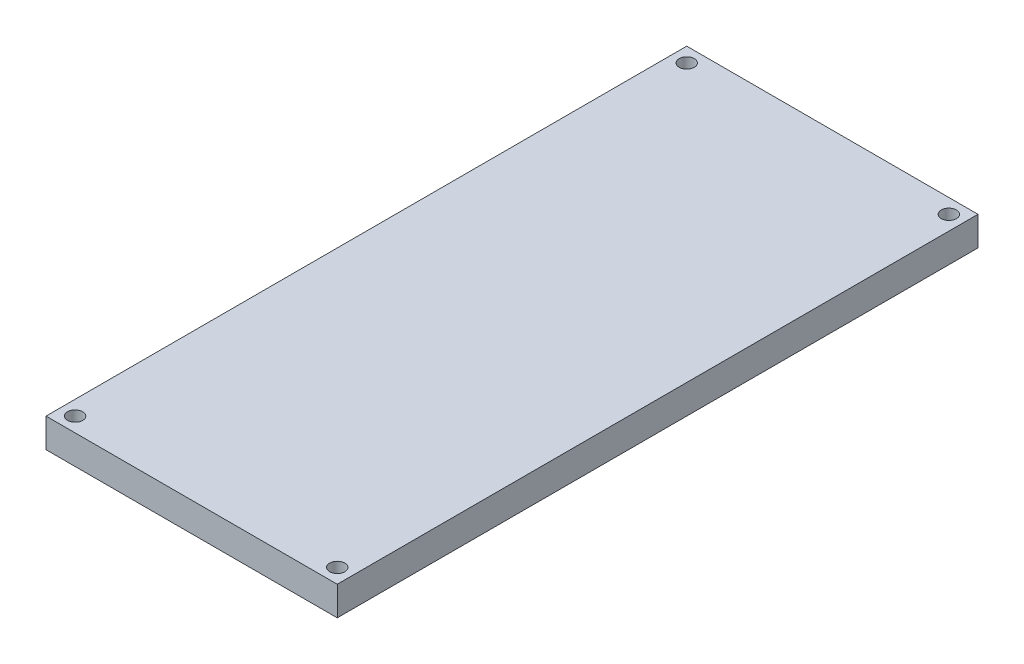
ISO-10303-21;
HEADER;
FILE_DESCRIPTION(('STEP AP214'),'2;1');
FILE_NAME('part.step','',(''),(''),'','','');
FILE_SCHEMA(('AUTOMOTIVE_DESIGN { 1 0 10303 214 1 1 1 1 }'));
ENDSEC;
DATA;
#1=APPLICATION_CONTEXT('core data for automotive mechanical design processes');
#2=APPLICATION_PROTOCOL_DEFINITION('international standard','automotive_design',2000,#1);
#3=PRODUCT_CONTEXT('',#1,'mechanical');
#4=PRODUCT('Part','Part','',(#3));
#5=PRODUCT_RELATED_PRODUCT_CATEGORY('part','',(#4));
#6=PRODUCT_DEFINITION_FORMATION('','',#4);
#7=PRODUCT_DEFINITION_CONTEXT('part definition',#1,'design');
#8=PRODUCT_DEFINITION('design','',#6,#7);
#9=PRODUCT_DEFINITION_SHAPE('','',#8);
#10=(LENGTH_UNIT() NAMED_UNIT(*) SI_UNIT(.MILLI.,.METRE.));
#11=(NAMED_UNIT(*) PLANE_ANGLE_UNIT() SI_UNIT($,.RADIAN.));
#12=(NAMED_UNIT(*) SI_UNIT($,.STERADIAN.) SOLID_ANGLE_UNIT());
#13=UNCERTAINTY_MEASURE_WITH_UNIT(LENGTH_MEASURE(1.E-05),#10,'distance_accuracy_value','');
#14=(GEOMETRIC_REPRESENTATION_CONTEXT(3) GLOBAL_UNCERTAINTY_ASSIGNED_CONTEXT((#13)) GLOBAL_UNIT_ASSIGNED_CONTEXT((#10,
#11,#12)) REPRESENTATION_CONTEXT('',''));
#15=CARTESIAN_POINT('',(0.,0.,0.));
#16=DIRECTION('',(0.,0.,1.));
#17=DIRECTION('',(1.,0.,0.));
#18=AXIS2_PLACEMENT_3D('',#15,#16,#17);
#19=CARTESIAN_POINT('',(31.75,6.35,69.85));
#20=DIRECTION('',(-1.,0.,0.));
#21=DIRECTION('',(0.,0.,1.));
#22=AXIS2_PLACEMENT_3D('',#19,#20,#21);
#23=PLANE('',#22);
#24=DIRECTION('',(0.,0.,-1.));
#25=VECTOR('',#24,1.);
#26=CARTESIAN_POINT('',(31.75,0.,69.85));
#27=LINE('',#26,#25);
#28=CARTESIAN_POINT('',(31.75,0.,69.85));
#29=VERTEX_POINT('',#28);
#30=CARTESIAN_POINT('',(31.75,0.,-69.85));
#31=VERTEX_POINT('',#30);
#32=EDGE_CURVE('E113',#29,#31,#27,.T.);
#33=ORIENTED_EDGE('',*,*,#32,.T.);
#34=DIRECTION('',(0.,-1.,0.));
#35=VECTOR('',#34,1.);
#36=CARTESIAN_POINT('',(31.75,6.35,-69.85));
#37=LINE('',#36,#35);
#38=CARTESIAN_POINT('',(31.75,6.35,-69.85));
#39=VERTEX_POINT('',#38);
#40=EDGE_CURVE('E11',#39,#31,#37,.T.);
#41=ORIENTED_EDGE('',*,*,#40,.F.);
#42=DIRECTION('',(0.,0.,-1.));
#43=VECTOR('',#42,1.);
#44=CARTESIAN_POINT('',(31.75,6.35,69.85));
#45=LINE('',#44,#43);
#46=CARTESIAN_POINT('',(31.75,6.35,69.85));
#47=VERTEX_POINT('',#46);
#48=EDGE_CURVE('E97',#47,#39,#45,.T.);
#49=ORIENTED_EDGE('',*,*,#48,.F.);
#50=DIRECTION('',(0.,-1.,0.));
#51=VECTOR('',#50,1.);
#52=CARTESIAN_POINT('',(31.75,6.35,69.85));
#53=LINE('',#52,#51);
#54=EDGE_CURVE('E109',#47,#29,#53,.T.);
#55=ORIENTED_EDGE('',*,*,#54,.T.);
#56=EDGE_LOOP('',(#33,#41,#49,#55));
#57=FACE_BOUND('',#56,.T.);
#58=ADVANCED_FACE('F45',(#57),#23,.F.);
#59=CARTESIAN_POINT('',(-31.75,6.35,-69.85));
#60=DIRECTION('',(0.,0.,1.));
#61=DIRECTION('',(1.,0.,0.));
#62=AXIS2_PLACEMENT_3D('',#59,#60,#61);
#63=PLANE('',#62);
#64=DIRECTION('',(-1.,0.,0.));
#65=VECTOR('',#64,1.);
#66=CARTESIAN_POINT('',(-31.75,0.,-69.85));
#67=LINE('',#66,#65);
#68=CARTESIAN_POINT('',(-31.75,0.,-69.85));
#69=VERTEX_POINT('',#68);
#70=EDGE_CURVE('E102',#31,#69,#67,.T.);
#71=ORIENTED_EDGE('',*,*,#70,.T.);
#72=DIRECTION('',(0.,-1.,0.));
#73=VECTOR('',#72,1.);
#74=CARTESIAN_POINT('',(-31.75,6.35,-69.85));
#75=LINE('',#74,#73);
#76=CARTESIAN_POINT('',(-31.75,6.35,-69.85));
#77=VERTEX_POINT('',#76);
#78=EDGE_CURVE('E54',#77,#69,#75,.T.);
#79=ORIENTED_EDGE('',*,*,#78,.F.);
#80=DIRECTION('',(-1.,0.,0.));
#81=VECTOR('',#80,1.);
#82=CARTESIAN_POINT('',(-31.75,6.35,-69.85));
#83=LINE('',#82,#81);
#84=EDGE_CURVE('E92',#39,#77,#83,.T.);
#85=ORIENTED_EDGE('',*,*,#84,.F.);
#86=ORIENTED_EDGE('',*,*,#40,.T.);
#87=EDGE_LOOP('',(#71,#79,#85,#86));
#88=FACE_BOUND('',#87,.T.);
#89=ADVANCED_FACE('F101',(#88),#63,.F.);
#90=CARTESIAN_POINT('',(-31.75,6.35,69.85));
#91=DIRECTION('',(1.,0.,0.));
#92=DIRECTION('',(0.,0.,-1.));
#93=AXIS2_PLACEMENT_3D('',#90,#91,#92);
#94=PLANE('',#93);
#95=DIRECTION('',(0.,0.,1.));
#96=VECTOR('',#95,1.);
#97=CARTESIAN_POINT('',(-31.75,0.,69.85));
#98=LINE('',#97,#96);
#99=CARTESIAN_POINT('',(-31.75,0.,69.85));
#100=VERTEX_POINT('',#99);
#101=EDGE_CURVE('E79',#69,#100,#98,.T.);
#102=ORIENTED_EDGE('',*,*,#101,.T.);
#103=DIRECTION('',(0.,-1.,0.));
#104=VECTOR('',#103,1.);
#105=CARTESIAN_POINT('',(-31.75,6.35,69.85));
#106=LINE('',#105,#104);
#107=CARTESIAN_POINT('',(-31.75,6.35,69.85));
#108=VERTEX_POINT('',#107);
#109=EDGE_CURVE('E104',#108,#100,#106,.T.);
#110=ORIENTED_EDGE('',*,*,#109,.F.);
#111=DIRECTION('',(0.,0.,1.));
#112=VECTOR('',#111,1.);
#113=CARTESIAN_POINT('',(-31.75,6.35,69.85));
#114=LINE('',#113,#112);
#115=EDGE_CURVE('E95',#77,#108,#114,.T.);
#116=ORIENTED_EDGE('',*,*,#115,.F.);
#117=ORIENTED_EDGE('',*,*,#78,.T.);
#118=EDGE_LOOP('',(#102,#110,#116,#117));
#119=FACE_BOUND('',#118,.T.);
#120=ADVANCED_FACE('F105',(#119),#94,.F.);
#121=CARTESIAN_POINT('',(-31.75,6.35,69.85));
#122=DIRECTION('',(0.,0.,-1.));
#123=DIRECTION('',(-1.,0.,0.));
#124=AXIS2_PLACEMENT_3D('',#121,#122,#123);
#125=PLANE('',#124);
#126=DIRECTION('',(1.,0.,0.));
#127=VECTOR('',#126,1.);
#128=CARTESIAN_POINT('',(-31.75,0.,69.85));
#129=LINE('',#128,#127);
#130=EDGE_CURVE('E85',#100,#29,#129,.T.);
#131=ORIENTED_EDGE('',*,*,#130,.T.);
#132=ORIENTED_EDGE('',*,*,#54,.F.);
#133=DIRECTION('',(1.,0.,0.));
#134=VECTOR('',#133,1.);
#135=CARTESIAN_POINT('',(-31.75,6.35,69.85));
#136=LINE('',#135,#134);
#137=EDGE_CURVE('E62',#108,#47,#136,.T.);
#138=ORIENTED_EDGE('',*,*,#137,.F.);
#139=ORIENTED_EDGE('',*,*,#109,.T.);
#140=EDGE_LOOP('',(#131,#132,#138,#139));
#141=FACE_BOUND('',#140,.T.);
#142=ADVANCED_FACE('F127',(#141),#125,.F.);
#143=CARTESIAN_POINT('',(0.,6.35,0.));
#144=DIRECTION('',(0.,-1.,0.));
#145=DIRECTION('',(0.,0.,-1.));
#146=AXIS2_PLACEMENT_3D('',#143,#144,#145);
#147=PLANE('',#146);
#148=CARTESIAN_POINT('',(-28.575,6.35,-66.675));
#149=DIRECTION('',(0.,1.,0.));
#150=DIRECTION('',(0.,0.,1.));
#151=AXIS2_PLACEMENT_3D('',#148,#149,#150);
#152=CIRCLE('',#151,1.65);
#153=CARTESIAN_POINT('',(-28.575,6.35,-65.025));
#154=VERTEX_POINT('',#153);
#155=EDGE_CURVE('E146',#154,#154,#152,.T.);
#156=ORIENTED_EDGE('',*,*,#155,.F.);
#157=EDGE_LOOP('',(#156));
#158=FACE_BOUND('',#157,.T.);
#159=CARTESIAN_POINT('',(-28.575,6.35,66.675));
#160=DIRECTION('',(0.,1.,0.));
#161=DIRECTION('',(0.,0.,1.));
#162=AXIS2_PLACEMENT_3D('',#159,#160,#161);
#163=CIRCLE('',#162,1.65);
#164=CARTESIAN_POINT('',(-28.575,6.35,68.325));
#165=VERTEX_POINT('',#164);
#166=EDGE_CURVE('E154',#165,#165,#163,.T.);
#167=ORIENTED_EDGE('',*,*,#166,.F.);
#168=EDGE_LOOP('',(#167));
#169=FACE_BOUND('',#168,.T.);
#170=CARTESIAN_POINT('',(28.575,6.35,66.675));
#171=DIRECTION('',(0.,1.,0.));
#172=DIRECTION('',(0.,0.,1.));
#173=AXIS2_PLACEMENT_3D('',#170,#171,#172);
#174=CIRCLE('',#173,1.65);
#175=CARTESIAN_POINT('',(28.575,6.35,68.325));
#176=VERTEX_POINT('',#175);
#177=EDGE_CURVE('E138',#176,#176,#174,.T.);
#178=ORIENTED_EDGE('',*,*,#177,.F.);
#179=EDGE_LOOP('',(#178));
#180=FACE_BOUND('',#179,.T.);
#181=CARTESIAN_POINT('',(28.575,6.35,-66.675));
#182=DIRECTION('',(0.,1.,0.));
#183=DIRECTION('',(0.,0.,1.));
#184=AXIS2_PLACEMENT_3D('',#181,#182,#183);
#185=CIRCLE('',#184,1.65);
#186=CARTESIAN_POINT('',(28.575,6.35,-65.025));
#187=VERTEX_POINT('',#186);
#188=EDGE_CURVE('E134',#187,#187,#185,.T.);
#189=ORIENTED_EDGE('',*,*,#188,.F.);
#190=EDGE_LOOP('',(#189));
#191=FACE_BOUND('',#190,.T.);
#192=ORIENTED_EDGE('',*,*,#48,.T.);
#193=ORIENTED_EDGE('',*,*,#84,.T.);
#194=ORIENTED_EDGE('',*,*,#115,.T.);
#195=ORIENTED_EDGE('',*,*,#137,.T.);
#196=EDGE_LOOP('',(#192,#193,#194,#195));
#197=FACE_BOUND('',#196,.T.);
#198=ADVANCED_FACE('F93',(#158,#169,#180,#191,#197),#147,.F.);
#199=CARTESIAN_POINT('',(0.,0.,0.));
#200=DIRECTION('',(0.,-1.,0.));
#201=DIRECTION('',(0.,0.,-1.));
#202=AXIS2_PLACEMENT_3D('',#199,#200,#201);
#203=PLANE('',#202);
#204=CARTESIAN_POINT('',(-28.575,0.,-66.675));
#205=DIRECTION('',(0.,1.,0.));
#206=DIRECTION('',(0.,0.,1.));
#207=AXIS2_PLACEMENT_3D('',#204,#205,#206);
#208=CIRCLE('',#207,1.65);
#209=CARTESIAN_POINT('',(-28.575,0.,-65.025));
#210=VERTEX_POINT('',#209);
#211=EDGE_CURVE('E142',#210,#210,#208,.T.);
#212=ORIENTED_EDGE('',*,*,#211,.T.);
#213=EDGE_LOOP('',(#212));
#214=FACE_BOUND('',#213,.T.);
#215=CARTESIAN_POINT('',(-28.575,0.,66.675));
#216=DIRECTION('',(0.,1.,0.));
#217=DIRECTION('',(0.,0.,1.));
#218=AXIS2_PLACEMENT_3D('',#215,#216,#217);
#219=CIRCLE('',#218,1.65);
#220=CARTESIAN_POINT('',(-28.575,0.,68.325));
#221=VERTEX_POINT('',#220);
#222=EDGE_CURVE('E150',#221,#221,#219,.T.);
#223=ORIENTED_EDGE('',*,*,#222,.T.);
#224=EDGE_LOOP('',(#223));
#225=FACE_BOUND('',#224,.T.);
#226=CARTESIAN_POINT('',(28.575,0.,66.675));
#227=DIRECTION('',(0.,1.,0.));
#228=DIRECTION('',(0.,0.,1.));
#229=AXIS2_PLACEMENT_3D('',#226,#227,#228);
#230=CIRCLE('',#229,1.65);
#231=CARTESIAN_POINT('',(28.575,0.,68.325));
#232=VERTEX_POINT('',#231);
#233=EDGE_CURVE('E158',#232,#232,#230,.T.);
#234=ORIENTED_EDGE('',*,*,#233,.T.);
#235=EDGE_LOOP('',(#234));
#236=FACE_BOUND('',#235,.T.);
#237=CARTESIAN_POINT('',(28.575,0.,-66.675));
#238=DIRECTION('',(0.,1.,0.));
#239=DIRECTION('',(0.,0.,1.));
#240=AXIS2_PLACEMENT_3D('',#237,#238,#239);
#241=CIRCLE('',#240,1.65);
#242=CARTESIAN_POINT('',(28.575,0.,-65.025));
#243=VERTEX_POINT('',#242);
#244=EDGE_CURVE('E117',#243,#243,#241,.T.);
#245=ORIENTED_EDGE('',*,*,#244,.T.);
#246=EDGE_LOOP('',(#245));
#247=FACE_BOUND('',#246,.T.);
#248=ORIENTED_EDGE('',*,*,#32,.F.);
#249=ORIENTED_EDGE('',*,*,#130,.F.);
#250=ORIENTED_EDGE('',*,*,#101,.F.);
#251=ORIENTED_EDGE('',*,*,#70,.F.);
#252=EDGE_LOOP('',(#248,#249,#250,#251));
#253=FACE_BOUND('',#252,.T.);
#254=ADVANCED_FACE('F130',(#214,#225,#236,#247,#253),#203,.T.);
#255=CARTESIAN_POINT('',(28.575,0.,-66.675));
#256=DIRECTION('',(0.,1.,0.));
#257=DIRECTION('',(0.,0.,1.));
#258=AXIS2_PLACEMENT_3D('',#255,#256,#257);
#259=CYLINDRICAL_SURFACE('',#258,1.65);
#260=ORIENTED_EDGE('',*,*,#244,.F.);
#261=EDGE_LOOP('',(#260));
#262=FACE_BOUND('',#261,.T.);
#263=ORIENTED_EDGE('',*,*,#188,.T.);
#264=EDGE_LOOP('',(#263));
#265=FACE_BOUND('',#264,.T.);
#266=ADVANCED_FACE('F174',(#262,#265),#259,.F.);
#267=CARTESIAN_POINT('',(28.575,0.,66.675));
#268=DIRECTION('',(0.,1.,0.));
#269=DIRECTION('',(0.,0.,1.));
#270=AXIS2_PLACEMENT_3D('',#267,#268,#269);
#271=CYLINDRICAL_SURFACE('',#270,1.65);
#272=ORIENTED_EDGE('',*,*,#233,.F.);
#273=EDGE_LOOP('',(#272));
#274=FACE_BOUND('',#273,.T.);
#275=ORIENTED_EDGE('',*,*,#177,.T.);
#276=EDGE_LOOP('',(#275));
#277=FACE_BOUND('',#276,.T.);
#278=ADVANCED_FACE('F166',(#274,#277),#271,.F.);
#279=CARTESIAN_POINT('',(-28.575,0.,66.675));
#280=DIRECTION('',(0.,1.,0.));
#281=DIRECTION('',(0.,0.,1.));
#282=AXIS2_PLACEMENT_3D('',#279,#280,#281);
#283=CYLINDRICAL_SURFACE('',#282,1.65);
#284=ORIENTED_EDGE('',*,*,#222,.F.);
#285=EDGE_LOOP('',(#284));
#286=FACE_BOUND('',#285,.T.);
#287=ORIENTED_EDGE('',*,*,#166,.T.);
#288=EDGE_LOOP('',(#287));
#289=FACE_BOUND('',#288,.T.);
#290=ADVANCED_FACE('F182',(#286,#289),#283,.F.);
#291=CARTESIAN_POINT('',(-28.575,0.,-66.675));
#292=DIRECTION('',(0.,1.,0.));
#293=DIRECTION('',(0.,0.,1.));
#294=AXIS2_PLACEMENT_3D('',#291,#292,#293);
#295=CYLINDRICAL_SURFACE('',#294,1.65);
#296=ORIENTED_EDGE('',*,*,#211,.F.);
#297=EDGE_LOOP('',(#296));
#298=FACE_BOUND('',#297,.T.);
#299=ORIENTED_EDGE('',*,*,#155,.T.);
#300=EDGE_LOOP('',(#299));
#301=FACE_BOUND('',#300,.T.);
#302=ADVANCED_FACE('F233',(#298,#301),#295,.F.);
#303=CLOSED_SHELL('',(#58,#89,#120,#142,#198,#254,#266,#278,#290,#302));
#304=MANIFOLD_SOLID_BREP('B2',#303);
#305=ADVANCED_BREP_SHAPE_REPRESENTATION('',(#18,#304),#14);
#306=SHAPE_DEFINITION_REPRESENTATION(#9,#305);
ENDSEC;
END-ISO-10303-21;
